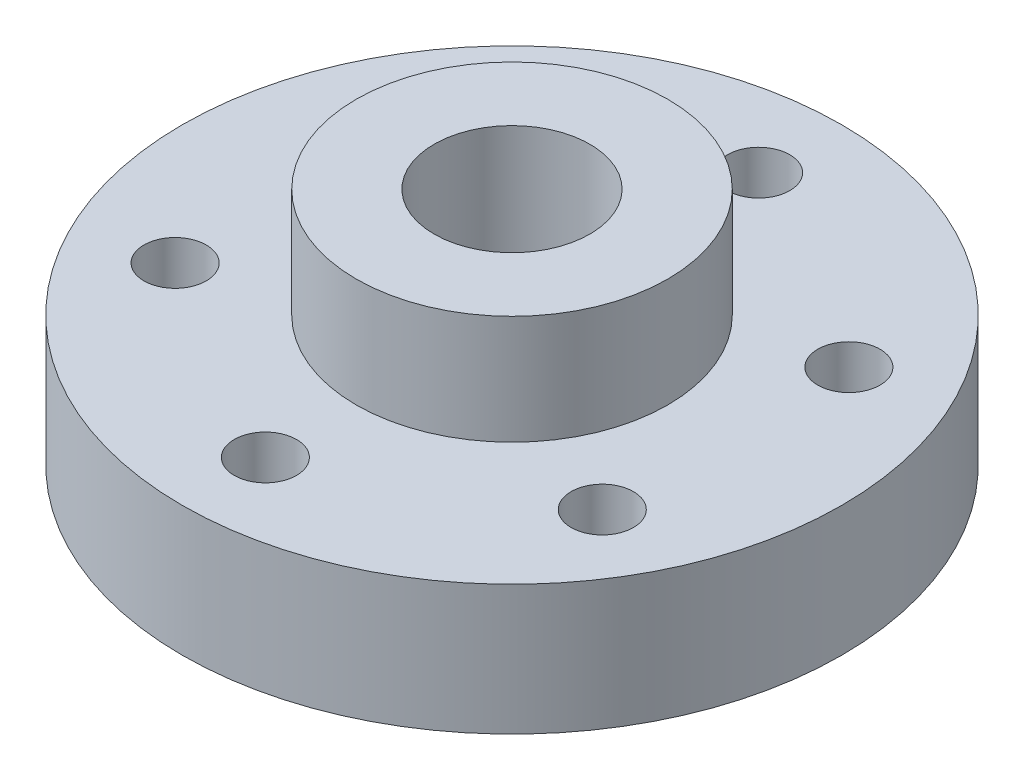
ISO-10303-21;
HEADER;
FILE_DESCRIPTION(('STEP AP214'),'2;1');
FILE_NAME('part.step','',(''),(''),'','','');
FILE_SCHEMA(('AUTOMOTIVE_DESIGN { 1 0 10303 214 1 1 1 1 }'));
ENDSEC;
DATA;
#1=APPLICATION_CONTEXT('core data for automotive mechanical design processes');
#2=APPLICATION_PROTOCOL_DEFINITION('international standard','automotive_design',2000,#1);
#3=PRODUCT_CONTEXT('',#1,'mechanical');
#4=PRODUCT('Part','Part','',(#3));
#5=PRODUCT_RELATED_PRODUCT_CATEGORY('part','',(#4));
#6=PRODUCT_DEFINITION_FORMATION('','',#4);
#7=PRODUCT_DEFINITION_CONTEXT('part definition',#1,'design');
#8=PRODUCT_DEFINITION('design','',#6,#7);
#9=PRODUCT_DEFINITION_SHAPE('','',#8);
#10=(LENGTH_UNIT() NAMED_UNIT(*) SI_UNIT(.MILLI.,.METRE.));
#11=(NAMED_UNIT(*) PLANE_ANGLE_UNIT() SI_UNIT($,.RADIAN.));
#12=(NAMED_UNIT(*) SI_UNIT($,.STERADIAN.) SOLID_ANGLE_UNIT());
#13=UNCERTAINTY_MEASURE_WITH_UNIT(LENGTH_MEASURE(1.E-05),#10,'distance_accuracy_value','');
#14=(GEOMETRIC_REPRESENTATION_CONTEXT(3) GLOBAL_UNCERTAINTY_ASSIGNED_CONTEXT((#13)) GLOBAL_UNIT_ASSIGNED_CONTEXT((#10,
#11,#12)) REPRESENTATION_CONTEXT('',''));
#15=CARTESIAN_POINT('',(0.,0.,0.));
#16=DIRECTION('',(0.,0.,1.));
#17=DIRECTION('',(1.,0.,0.));
#18=AXIS2_PLACEMENT_3D('',#15,#16,#17);
#19=CARTESIAN_POINT('',(0.,5.,0.));
#20=DIRECTION('',(0.,1.,0.));
#21=DIRECTION('',(0.,0.,1.));
#22=AXIS2_PLACEMENT_3D('',#19,#20,#21);
#23=PLANE('',#22);
#24=CARTESIAN_POINT('',(-8.22724133595197,5.,-4.74999999999964));
#25=DIRECTION('',(0.,1.,0.));
#26=DIRECTION('',(0.,0.,1.));
#27=AXIS2_PLACEMENT_3D('',#24,#25,#26);
#28=CIRCLE('',#27,1.20000000000041);
#29=CARTESIAN_POINT('',(-8.22724133595197,5.,-3.54999999999923));
#30=VERTEX_POINT('',#29);
#31=EDGE_CURVE('E86',#30,#30,#28,.T.);
#32=ORIENTED_EDGE('',*,*,#31,.F.);
#33=EDGE_LOOP('',(#32));
#34=FACE_BOUND('',#33,.T.);
#35=CARTESIAN_POINT('',(-8.22724133595156,5.,4.75000000000035));
#36=DIRECTION('',(0.,1.,0.));
#37=DIRECTION('',(0.,0.,1.));
#38=AXIS2_PLACEMENT_3D('',#35,#36,#37);
#39=CIRCLE('',#38,1.20000000000077);
#40=CARTESIAN_POINT('',(-8.22724133595156,5.,5.95000000000112));
#41=VERTEX_POINT('',#40);
#42=EDGE_CURVE('E80',#41,#41,#39,.T.);
#43=ORIENTED_EDGE('',*,*,#42,.F.);
#44=EDGE_LOOP('',(#43));
#45=FACE_BOUND('',#44,.T.);
#46=CARTESIAN_POINT('',(8.07691889848134E-13,5.,9.5));
#47=DIRECTION('',(0.,1.,0.));
#48=DIRECTION('',(0.,0.,1.));
#49=AXIS2_PLACEMENT_3D('',#46,#47,#48);
#50=CIRCLE('',#49,1.20000000000084);
#51=CARTESIAN_POINT('',(8.07691889848134E-13,5.,10.7000000000008));
#52=VERTEX_POINT('',#51);
#53=EDGE_CURVE('E74',#52,#52,#50,.T.);
#54=ORIENTED_EDGE('',*,*,#53,.F.);
#55=EDGE_LOOP('',(#54));
#56=FACE_BOUND('',#55,.T.);
#57=CARTESIAN_POINT('',(8.22724133595277,5.,4.74999999999965));
#58=DIRECTION('',(0.,1.,0.));
#59=DIRECTION('',(0.,0.,1.));
#60=AXIS2_PLACEMENT_3D('',#57,#58,#59);
#61=CIRCLE('',#60,1.20000000000052);
#62=CARTESIAN_POINT('',(8.22724133595277,5.,5.95000000000017));
#63=VERTEX_POINT('',#62);
#64=EDGE_CURVE('E68',#63,#63,#61,.T.);
#65=ORIENTED_EDGE('',*,*,#64,.F.);
#66=EDGE_LOOP('',(#65));
#67=FACE_BOUND('',#66,.T.);
#68=CARTESIAN_POINT('',(8.22724133595237,5.,-4.75000000000035));
#69=DIRECTION('',(0.,1.,0.));
#70=DIRECTION('',(0.,0.,1.));
#71=AXIS2_PLACEMENT_3D('',#68,#69,#70);
#72=CIRCLE('',#71,1.20000000000012);
#73=CARTESIAN_POINT('',(8.22724133595237,5.,-3.55000000000024));
#74=VERTEX_POINT('',#73);
#75=EDGE_CURVE('E62',#74,#74,#72,.T.);
#76=ORIENTED_EDGE('',*,*,#75,.F.);
#77=EDGE_LOOP('',(#76));
#78=FACE_BOUND('',#77,.T.);
#79=CARTESIAN_POINT('',(0.,5.,-9.5));
#80=DIRECTION('',(0.,1.,0.));
#81=DIRECTION('',(0.,0.,1.));
#82=AXIS2_PLACEMENT_3D('',#79,#80,#81);
#83=CIRCLE('',#82,1.2);
#84=CARTESIAN_POINT('',(0.,5.,-8.3));
#85=VERTEX_POINT('',#84);
#86=EDGE_CURVE('E56',#85,#85,#83,.T.);
#87=ORIENTED_EDGE('',*,*,#86,.F.);
#88=EDGE_LOOP('',(#87));
#89=FACE_BOUND('',#88,.T.);
#90=CARTESIAN_POINT('',(0.,5.,0.));
#91=DIRECTION('',(0.,1.,0.));
#92=DIRECTION('',(0.,0.,1.));
#93=AXIS2_PLACEMENT_3D('',#90,#91,#92);
#94=CIRCLE('',#93,12.7);
#95=CARTESIAN_POINT('',(0.,5.,12.7));
#96=VERTEX_POINT('',#95);
#97=EDGE_CURVE('E10',#96,#96,#94,.T.);
#98=ORIENTED_EDGE('',*,*,#97,.T.);
#99=EDGE_LOOP('',(#98));
#100=FACE_BOUND('',#99,.T.);
#101=CARTESIAN_POINT('',(0.,5.,0.));
#102=DIRECTION('',(0.,1.,0.));
#103=DIRECTION('',(0.,0.,1.));
#104=AXIS2_PLACEMENT_3D('',#101,#102,#103);
#105=CIRCLE('',#104,6.);
#106=CARTESIAN_POINT('',(0.,5.,6.));
#107=VERTEX_POINT('',#106);
#108=EDGE_CURVE('E47',#107,#107,#105,.T.);
#109=ORIENTED_EDGE('',*,*,#108,.F.);
#110=EDGE_LOOP('',(#109));
#111=FACE_BOUND('',#110,.T.);
#112=ADVANCED_FACE('F31',(#34,#45,#56,#67,#78,#89,#100,#111),#23,.T.);
#113=CARTESIAN_POINT('',(0.,0.,0.));
#114=DIRECTION('',(0.,1.,0.));
#115=DIRECTION('',(0.,0.,1.));
#116=AXIS2_PLACEMENT_3D('',#113,#114,#115);
#117=PLANE('',#116);
#118=CARTESIAN_POINT('',(-8.22724133595197,0.,-4.74999999999964));
#119=DIRECTION('',(0.,1.,0.));
#120=DIRECTION('',(0.,0.,1.));
#121=AXIS2_PLACEMENT_3D('',#118,#119,#120);
#122=CIRCLE('',#121,1.20000000000041);
#123=CARTESIAN_POINT('',(-8.22724133595197,0.,-3.54999999999923));
#124=VERTEX_POINT('',#123);
#125=EDGE_CURVE('E83',#124,#124,#122,.T.);
#126=ORIENTED_EDGE('',*,*,#125,.T.);
#127=EDGE_LOOP('',(#126));
#128=FACE_BOUND('',#127,.T.);
#129=CARTESIAN_POINT('',(-8.22724133595156,0.,4.75000000000035));
#130=DIRECTION('',(0.,1.,0.));
#131=DIRECTION('',(0.,0.,1.));
#132=AXIS2_PLACEMENT_3D('',#129,#130,#131);
#133=CIRCLE('',#132,1.20000000000077);
#134=CARTESIAN_POINT('',(-8.22724133595156,0.,5.95000000000112));
#135=VERTEX_POINT('',#134);
#136=EDGE_CURVE('E77',#135,#135,#133,.T.);
#137=ORIENTED_EDGE('',*,*,#136,.T.);
#138=EDGE_LOOP('',(#137));
#139=FACE_BOUND('',#138,.T.);
#140=CARTESIAN_POINT('',(8.07691889848134E-13,0.,9.5));
#141=DIRECTION('',(0.,1.,0.));
#142=DIRECTION('',(0.,0.,1.));
#143=AXIS2_PLACEMENT_3D('',#140,#141,#142);
#144=CIRCLE('',#143,1.20000000000084);
#145=CARTESIAN_POINT('',(8.07691889848134E-13,0.,10.7000000000008));
#146=VERTEX_POINT('',#145);
#147=EDGE_CURVE('E71',#146,#146,#144,.T.);
#148=ORIENTED_EDGE('',*,*,#147,.T.);
#149=EDGE_LOOP('',(#148));
#150=FACE_BOUND('',#149,.T.);
#151=CARTESIAN_POINT('',(8.22724133595277,0.,4.74999999999965));
#152=DIRECTION('',(0.,1.,0.));
#153=DIRECTION('',(0.,0.,1.));
#154=AXIS2_PLACEMENT_3D('',#151,#152,#153);
#155=CIRCLE('',#154,1.20000000000052);
#156=CARTESIAN_POINT('',(8.22724133595277,0.,5.95000000000017));
#157=VERTEX_POINT('',#156);
#158=EDGE_CURVE('E65',#157,#157,#155,.T.);
#159=ORIENTED_EDGE('',*,*,#158,.T.);
#160=EDGE_LOOP('',(#159));
#161=FACE_BOUND('',#160,.T.);
#162=CARTESIAN_POINT('',(8.22724133595237,0.,-4.75000000000035));
#163=DIRECTION('',(0.,1.,0.));
#164=DIRECTION('',(0.,0.,1.));
#165=AXIS2_PLACEMENT_3D('',#162,#163,#164);
#166=CIRCLE('',#165,1.20000000000012);
#167=CARTESIAN_POINT('',(8.22724133595237,0.,-3.55000000000024));
#168=VERTEX_POINT('',#167);
#169=EDGE_CURVE('E59',#168,#168,#166,.T.);
#170=ORIENTED_EDGE('',*,*,#169,.T.);
#171=EDGE_LOOP('',(#170));
#172=FACE_BOUND('',#171,.T.);
#173=CARTESIAN_POINT('',(0.,0.,-9.5));
#174=DIRECTION('',(0.,1.,0.));
#175=DIRECTION('',(0.,0.,1.));
#176=AXIS2_PLACEMENT_3D('',#173,#174,#175);
#177=CIRCLE('',#176,1.2);
#178=CARTESIAN_POINT('',(0.,0.,-8.3));
#179=VERTEX_POINT('',#178);
#180=EDGE_CURVE('E55',#179,#179,#177,.T.);
#181=ORIENTED_EDGE('',*,*,#180,.T.);
#182=EDGE_LOOP('',(#181));
#183=FACE_BOUND('',#182,.T.);
#184=CARTESIAN_POINT('',(0.,0.,0.));
#185=DIRECTION('',(0.,1.,0.));
#186=DIRECTION('',(0.,0.,1.));
#187=AXIS2_PLACEMENT_3D('',#184,#185,#186);
#188=CIRCLE('',#187,12.7);
#189=CARTESIAN_POINT('',(0.,0.,12.7));
#190=VERTEX_POINT('',#189);
#191=EDGE_CURVE('E35',#190,#190,#188,.T.);
#192=ORIENTED_EDGE('',*,*,#191,.F.);
#193=EDGE_LOOP('',(#192));
#194=FACE_BOUND('',#193,.T.);
#195=CARTESIAN_POINT('',(0.,0.,0.));
#196=DIRECTION('',(0.,1.,0.));
#197=DIRECTION('',(0.,0.,1.));
#198=AXIS2_PLACEMENT_3D('',#195,#196,#197);
#199=CIRCLE('',#198,3.);
#200=CARTESIAN_POINT('',(0.,0.,3.));
#201=VERTEX_POINT('',#200);
#202=EDGE_CURVE('E42',#201,#201,#199,.T.);
#203=ORIENTED_EDGE('',*,*,#202,.T.);
#204=EDGE_LOOP('',(#203));
#205=FACE_BOUND('',#204,.T.);
#206=ADVANCED_FACE('F92',(#128,#139,#150,#161,#172,#183,#194,#205),#117,.F.);
#207=CARTESIAN_POINT('',(0.,5.,0.));
#208=DIRECTION('',(0.,-1.,0.));
#209=DIRECTION('',(0.,0.,-1.));
#210=AXIS2_PLACEMENT_3D('',#207,#208,#209);
#211=CYLINDRICAL_SURFACE('',#210,12.7);
#212=ORIENTED_EDGE('',*,*,#97,.F.);
#213=EDGE_LOOP('',(#212));
#214=FACE_BOUND('',#213,.T.);
#215=ORIENTED_EDGE('',*,*,#191,.T.);
#216=EDGE_LOOP('',(#215));
#217=FACE_BOUND('',#216,.T.);
#218=ADVANCED_FACE('F33',(#214,#217),#211,.T.);
#219=CARTESIAN_POINT('',(0.,5.,0.));
#220=DIRECTION('',(0.,-1.,0.));
#221=DIRECTION('',(0.,0.,-1.));
#222=AXIS2_PLACEMENT_3D('',#219,#220,#221);
#223=CYLINDRICAL_SURFACE('',#222,3.);
#224=ORIENTED_EDGE('',*,*,#202,.F.);
#225=EDGE_LOOP('',(#224));
#226=FACE_BOUND('',#225,.T.);
#227=CARTESIAN_POINT('',(0.,9.2,0.));
#228=DIRECTION('',(0.,1.,0.));
#229=DIRECTION('',(0.,0.,1.));
#230=AXIS2_PLACEMENT_3D('',#227,#228,#229);
#231=CIRCLE('',#230,3.);
#232=CARTESIAN_POINT('',(0.,9.2,3.));
#233=VERTEX_POINT('',#232);
#234=EDGE_CURVE('E50',#233,#233,#231,.T.);
#235=ORIENTED_EDGE('',*,*,#234,.T.);
#236=EDGE_LOOP('',(#235));
#237=FACE_BOUND('',#236,.T.);
#238=ADVANCED_FACE('F130',(#226,#237),#223,.F.);
#239=CARTESIAN_POINT('',(0.,9.2,0.));
#240=DIRECTION('',(0.,1.,0.));
#241=DIRECTION('',(0.,0.,1.));
#242=AXIS2_PLACEMENT_3D('',#239,#240,#241);
#243=PLANE('',#242);
#244=CARTESIAN_POINT('',(0.,9.2,0.));
#245=DIRECTION('',(0.,1.,0.));
#246=DIRECTION('',(0.,0.,1.));
#247=AXIS2_PLACEMENT_3D('',#244,#245,#246);
#248=CIRCLE('',#247,6.);
#249=CARTESIAN_POINT('',(0.,9.2,6.));
#250=VERTEX_POINT('',#249);
#251=EDGE_CURVE('E46',#250,#250,#248,.T.);
#252=ORIENTED_EDGE('',*,*,#251,.T.);
#253=EDGE_LOOP('',(#252));
#254=FACE_BOUND('',#253,.T.);
#255=ORIENTED_EDGE('',*,*,#234,.F.);
#256=EDGE_LOOP('',(#255));
#257=FACE_BOUND('',#256,.T.);
#258=ADVANCED_FACE('F120',(#254,#257),#243,.T.);
#259=CARTESIAN_POINT('',(0.,9.2,0.));
#260=DIRECTION('',(0.,-1.,0.));
#261=DIRECTION('',(0.,0.,-1.));
#262=AXIS2_PLACEMENT_3D('',#259,#260,#261);
#263=CYLINDRICAL_SURFACE('',#262,6.);
#264=ORIENTED_EDGE('',*,*,#251,.F.);
#265=EDGE_LOOP('',(#264));
#266=FACE_BOUND('',#265,.T.);
#267=ORIENTED_EDGE('',*,*,#108,.T.);
#268=EDGE_LOOP('',(#267));
#269=FACE_BOUND('',#268,.T.);
#270=ADVANCED_FACE('F117',(#266,#269),#263,.T.);
#271=CARTESIAN_POINT('',(0.,0.,-9.5));
#272=DIRECTION('',(0.,1.,0.));
#273=DIRECTION('',(0.,0.,1.));
#274=AXIS2_PLACEMENT_3D('',#271,#272,#273);
#275=CYLINDRICAL_SURFACE('',#274,1.2);
#276=ORIENTED_EDGE('',*,*,#180,.F.);
#277=EDGE_LOOP('',(#276));
#278=FACE_BOUND('',#277,.T.);
#279=ORIENTED_EDGE('',*,*,#86,.T.);
#280=EDGE_LOOP('',(#279));
#281=FACE_BOUND('',#280,.T.);
#282=ADVANCED_FACE('F119',(#278,#281),#275,.F.);
#283=CARTESIAN_POINT('',(8.22724133595237,0.,-4.75000000000035));
#284=DIRECTION('',(0.,1.,0.));
#285=DIRECTION('',(0.,0.,1.));
#286=AXIS2_PLACEMENT_3D('',#283,#284,#285);
#287=CYLINDRICAL_SURFACE('',#286,1.20000000000012);
#288=ORIENTED_EDGE('',*,*,#169,.F.);
#289=EDGE_LOOP('',(#288));
#290=FACE_BOUND('',#289,.T.);
#291=ORIENTED_EDGE('',*,*,#75,.T.);
#292=EDGE_LOOP('',(#291));
#293=FACE_BOUND('',#292,.T.);
#294=ADVANCED_FACE('F127',(#290,#293),#287,.F.);
#295=CARTESIAN_POINT('',(8.22724133595277,0.,4.74999999999965));
#296=DIRECTION('',(0.,1.,0.));
#297=DIRECTION('',(0.,0.,1.));
#298=AXIS2_PLACEMENT_3D('',#295,#296,#297);
#299=CYLINDRICAL_SURFACE('',#298,1.20000000000052);
#300=ORIENTED_EDGE('',*,*,#158,.F.);
#301=EDGE_LOOP('',(#300));
#302=FACE_BOUND('',#301,.T.);
#303=ORIENTED_EDGE('',*,*,#64,.T.);
#304=EDGE_LOOP('',(#303));
#305=FACE_BOUND('',#304,.T.);
#306=ADVANCED_FACE('F190',(#302,#305),#299,.F.);
#307=CARTESIAN_POINT('',(8.07691889848134E-13,0.,9.5));
#308=DIRECTION('',(0.,1.,0.));
#309=DIRECTION('',(0.,0.,1.));
#310=AXIS2_PLACEMENT_3D('',#307,#308,#309);
#311=CYLINDRICAL_SURFACE('',#310,1.20000000000084);
#312=ORIENTED_EDGE('',*,*,#147,.F.);
#313=EDGE_LOOP('',(#312));
#314=FACE_BOUND('',#313,.T.);
#315=ORIENTED_EDGE('',*,*,#53,.T.);
#316=EDGE_LOOP('',(#315));
#317=FACE_BOUND('',#316,.T.);
#318=ADVANCED_FACE('F200',(#314,#317),#311,.F.);
#319=CARTESIAN_POINT('',(-8.22724133595156,0.,4.75000000000035));
#320=DIRECTION('',(0.,1.,0.));
#321=DIRECTION('',(0.,0.,1.));
#322=AXIS2_PLACEMENT_3D('',#319,#320,#321);
#323=CYLINDRICAL_SURFACE('',#322,1.20000000000077);
#324=ORIENTED_EDGE('',*,*,#136,.F.);
#325=EDGE_LOOP('',(#324));
#326=FACE_BOUND('',#325,.T.);
#327=ORIENTED_EDGE('',*,*,#42,.T.);
#328=EDGE_LOOP('',(#327));
#329=FACE_BOUND('',#328,.T.);
#330=ADVANCED_FACE('F98',(#326,#329),#323,.F.);
#331=CARTESIAN_POINT('',(-8.22724133595197,0.,-4.74999999999964));
#332=DIRECTION('',(0.,1.,0.));
#333=DIRECTION('',(0.,0.,1.));
#334=AXIS2_PLACEMENT_3D('',#331,#332,#333);
#335=CYLINDRICAL_SURFACE('',#334,1.20000000000041);
#336=ORIENTED_EDGE('',*,*,#125,.F.);
#337=EDGE_LOOP('',(#336));
#338=FACE_BOUND('',#337,.T.);
#339=ORIENTED_EDGE('',*,*,#31,.T.);
#340=EDGE_LOOP('',(#339));
#341=FACE_BOUND('',#340,.T.);
#342=ADVANCED_FACE('F95',(#338,#341),#335,.F.);
#343=CLOSED_SHELL('',(#112,#206,#218,#238,#258,#270,#282,#294,#306,#318,#330,#342));
#344=MANIFOLD_SOLID_BREP('B2',#343);
#345=ADVANCED_BREP_SHAPE_REPRESENTATION('',(#18,#344),#14);
#346=SHAPE_DEFINITION_REPRESENTATION(#9,#345);
ENDSEC;
END-ISO-10303-21;
